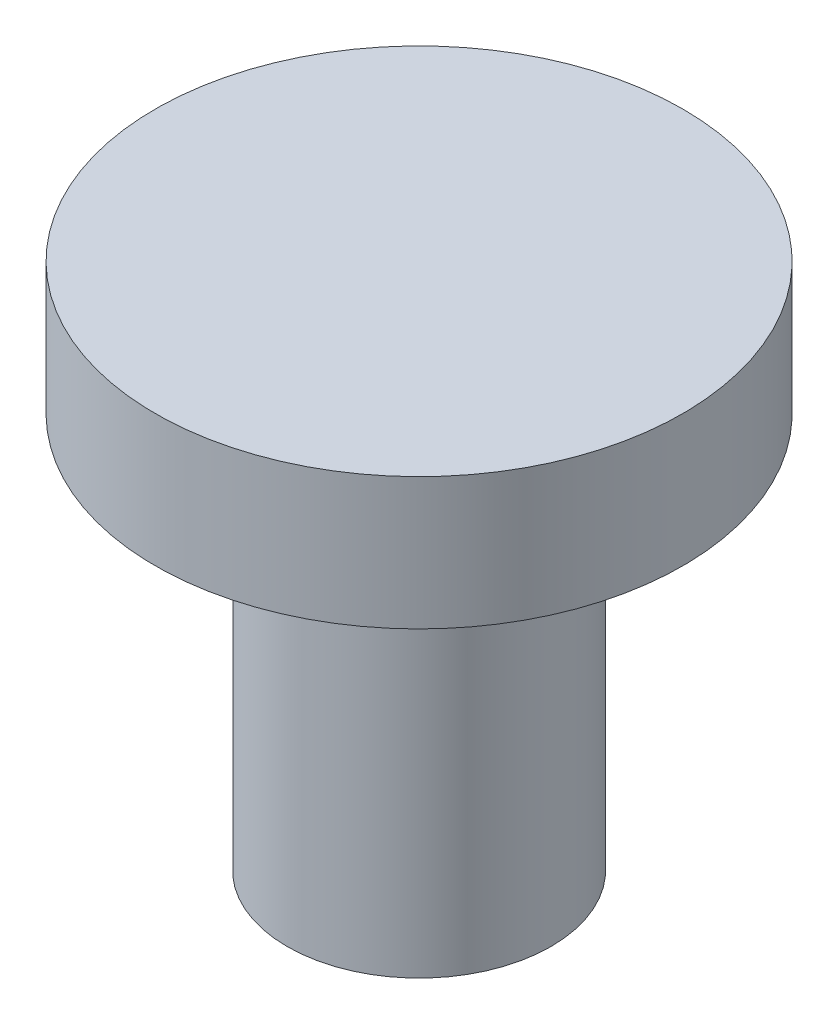
ISO-10303-21;
HEADER;
FILE_DESCRIPTION(('STEP AP214'),'2;1');
FILE_NAME('part.step','',(''),(''),'','','');
FILE_SCHEMA(('AUTOMOTIVE_DESIGN { 1 0 10303 214 1 1 1 1 }'));
ENDSEC;
DATA;
#1=APPLICATION_CONTEXT('core data for automotive mechanical design processes');
#2=APPLICATION_PROTOCOL_DEFINITION('international standard','automotive_design',2000,#1);
#3=PRODUCT_CONTEXT('',#1,'mechanical');
#4=PRODUCT('Part','Part','',(#3));
#5=PRODUCT_RELATED_PRODUCT_CATEGORY('part','',(#4));
#6=PRODUCT_DEFINITION_FORMATION('','',#4);
#7=PRODUCT_DEFINITION_CONTEXT('part definition',#1,'design');
#8=PRODUCT_DEFINITION('design','',#6,#7);
#9=PRODUCT_DEFINITION_SHAPE('','',#8);
#10=(LENGTH_UNIT() NAMED_UNIT(*) SI_UNIT(.MILLI.,.METRE.));
#11=(NAMED_UNIT(*) PLANE_ANGLE_UNIT() SI_UNIT($,.RADIAN.));
#12=(NAMED_UNIT(*) SI_UNIT($,.STERADIAN.) SOLID_ANGLE_UNIT());
#13=UNCERTAINTY_MEASURE_WITH_UNIT(LENGTH_MEASURE(1.E-05),#10,'distance_accuracy_value','');
#14=(GEOMETRIC_REPRESENTATION_CONTEXT(3) GLOBAL_UNCERTAINTY_ASSIGNED_CONTEXT((#13)) GLOBAL_UNIT_ASSIGNED_CONTEXT((#10,
#11,#12)) REPRESENTATION_CONTEXT('',''));
#15=CARTESIAN_POINT('',(0.,0.,0.));
#16=DIRECTION('',(0.,0.,1.));
#17=DIRECTION('',(1.,0.,0.));
#18=AXIS2_PLACEMENT_3D('',#15,#16,#17);
#19=CARTESIAN_POINT('',(0.,4.,0.));
#20=DIRECTION('',(0.,-1.,0.));
#21=DIRECTION('',(0.,0.,-1.));
#22=AXIS2_PLACEMENT_3D('',#19,#20,#21);
#23=CYLINDRICAL_SURFACE('',#22,2.);
#24=CARTESIAN_POINT('',(0.,4.,0.));
#25=DIRECTION('',(0.,-1.,0.));
#26=DIRECTION('',(0.,0.,-1.));
#27=AXIS2_PLACEMENT_3D('',#24,#25,#26);
#28=CIRCLE('',#27,2.);
#29=CARTESIAN_POINT('',(0.,4.,-2.));
#30=VERTEX_POINT('',#29);
#31=EDGE_CURVE('E10',#30,#30,#28,.T.);
#32=ORIENTED_EDGE('',*,*,#31,.T.);
#33=EDGE_LOOP('',(#32));
#34=FACE_BOUND('',#33,.T.);
#35=CARTESIAN_POINT('',(0.,3.,0.));
#36=DIRECTION('',(0.,-1.,0.));
#37=DIRECTION('',(0.,0.,-1.));
#38=AXIS2_PLACEMENT_3D('',#35,#36,#37);
#39=CIRCLE('',#38,2.);
#40=CARTESIAN_POINT('',(0.,3.,-2.));
#41=VERTEX_POINT('',#40);
#42=EDGE_CURVE('E47',#41,#41,#39,.T.);
#43=ORIENTED_EDGE('',*,*,#42,.F.);
#44=EDGE_LOOP('',(#43));
#45=FACE_BOUND('',#44,.T.);
#46=ADVANCED_FACE('F33',(#34,#45),#23,.T.);
#47=CARTESIAN_POINT('',(2.,4.,0.));
#48=DIRECTION('',(0.,1.,0.));
#49=DIRECTION('',(0.,0.,1.));
#50=AXIS2_PLACEMENT_3D('',#47,#48,#49);
#51=PLANE('',#50);
#52=ORIENTED_EDGE('',*,*,#31,.F.);
#53=EDGE_LOOP('',(#52));
#54=FACE_BOUND('',#53,.T.);
#55=ADVANCED_FACE('F57',(#54),#51,.T.);
#56=CARTESIAN_POINT('',(0.,0.,0.));
#57=DIRECTION('',(0.,-1.,0.));
#58=DIRECTION('',(0.,0.,-1.));
#59=AXIS2_PLACEMENT_3D('',#56,#57,#58);
#60=PLANE('',#59);
#61=CARTESIAN_POINT('',(0.,0.,0.));
#62=DIRECTION('',(0.,-1.,0.));
#63=DIRECTION('',(0.,0.,-1.));
#64=AXIS2_PLACEMENT_3D('',#61,#62,#63);
#65=CIRCLE('',#64,1.);
#66=CARTESIAN_POINT('',(0.,0.,-1.));
#67=VERTEX_POINT('',#66);
#68=EDGE_CURVE('E39',#67,#67,#65,.T.);
#69=ORIENTED_EDGE('',*,*,#68,.T.);
#70=EDGE_LOOP('',(#69));
#71=FACE_BOUND('',#70,.T.);
#72=ADVANCED_FACE('F61',(#71),#60,.T.);
#73=CARTESIAN_POINT('',(0.,4.,0.));
#74=DIRECTION('',(0.,-1.,0.));
#75=DIRECTION('',(0.,0.,-1.));
#76=AXIS2_PLACEMENT_3D('',#73,#74,#75);
#77=CYLINDRICAL_SURFACE('',#76,1.);
#78=CARTESIAN_POINT('',(0.,3.,0.));
#79=DIRECTION('',(0.,-1.,0.));
#80=DIRECTION('',(0.,0.,-1.));
#81=AXIS2_PLACEMENT_3D('',#78,#79,#80);
#82=CIRCLE('',#81,1.);
#83=CARTESIAN_POINT('',(0.,3.,-1.));
#84=VERTEX_POINT('',#83);
#85=EDGE_CURVE('E43',#84,#84,#82,.T.);
#86=ORIENTED_EDGE('',*,*,#85,.T.);
#87=EDGE_LOOP('',(#86));
#88=FACE_BOUND('',#87,.T.);
#89=ORIENTED_EDGE('',*,*,#68,.F.);
#90=EDGE_LOOP('',(#89));
#91=FACE_BOUND('',#90,.T.);
#92=ADVANCED_FACE('F66',(#88,#91),#77,.T.);
#93=CARTESIAN_POINT('',(1.,3.,0.));
#94=DIRECTION('',(0.,-1.,0.));
#95=DIRECTION('',(0.,0.,-1.));
#96=AXIS2_PLACEMENT_3D('',#93,#94,#95);
#97=PLANE('',#96);
#98=ORIENTED_EDGE('',*,*,#42,.T.);
#99=EDGE_LOOP('',(#98));
#100=FACE_BOUND('',#99,.T.);
#101=ORIENTED_EDGE('',*,*,#85,.F.);
#102=EDGE_LOOP('',(#101));
#103=FACE_BOUND('',#102,.T.);
#104=ADVANCED_FACE('F53',(#100,#103),#97,.T.);
#105=CLOSED_SHELL('',(#46,#55,#72,#92,#104));
#106=MANIFOLD_SOLID_BREP('B2',#105);
#107=ADVANCED_BREP_SHAPE_REPRESENTATION('',(#18,#106),#14);
#108=SHAPE_DEFINITION_REPRESENTATION(#9,#107);
ENDSEC;
END-ISO-10303-21;
